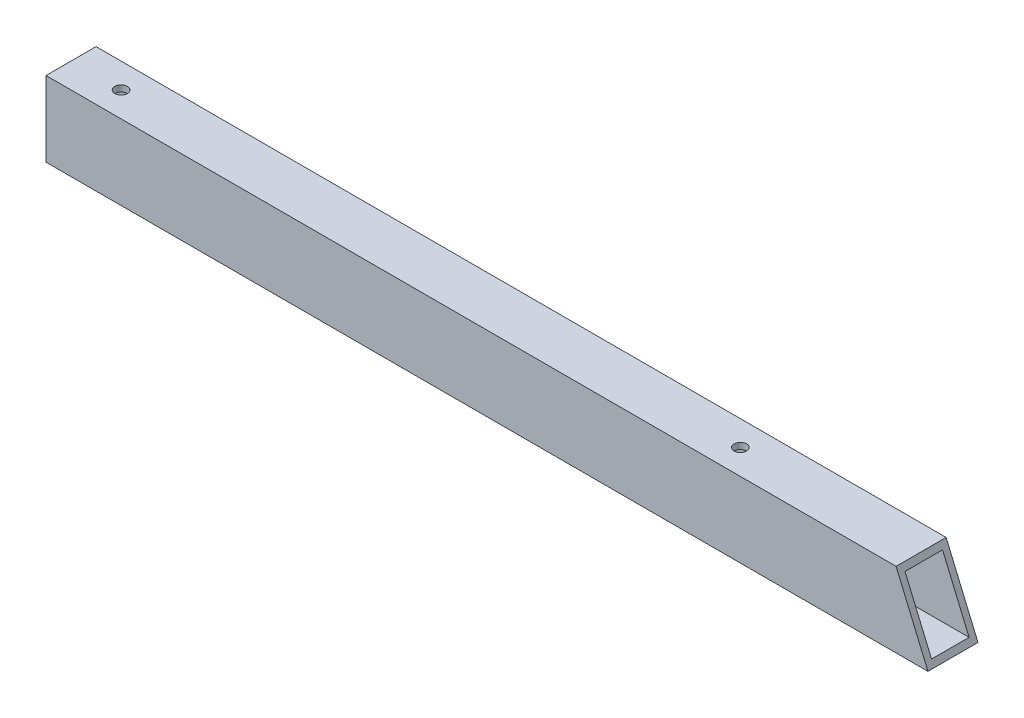
ISO-10303-21;
HEADER;
FILE_DESCRIPTION(('STEP AP214'),'2;1');
FILE_NAME('part.step','',(''),(''),'','','');
FILE_SCHEMA(('AUTOMOTIVE_DESIGN { 1 0 10303 214 1 1 1 1 }'));
ENDSEC;
DATA;
#1=APPLICATION_CONTEXT('core data for automotive mechanical design processes');
#2=APPLICATION_PROTOCOL_DEFINITION('international standard','automotive_design',2000,#1);
#3=PRODUCT_CONTEXT('',#1,'mechanical');
#4=PRODUCT('Part','Part','',(#3));
#5=PRODUCT_RELATED_PRODUCT_CATEGORY('part','',(#4));
#6=PRODUCT_DEFINITION_FORMATION('','',#4);
#7=PRODUCT_DEFINITION_CONTEXT('part definition',#1,'design');
#8=PRODUCT_DEFINITION('design','',#6,#7);
#9=PRODUCT_DEFINITION_SHAPE('','',#8);
#10=(LENGTH_UNIT() NAMED_UNIT(*) SI_UNIT(.MILLI.,.METRE.));
#11=(NAMED_UNIT(*) PLANE_ANGLE_UNIT() SI_UNIT($,.RADIAN.));
#12=(NAMED_UNIT(*) SI_UNIT($,.STERADIAN.) SOLID_ANGLE_UNIT());
#13=UNCERTAINTY_MEASURE_WITH_UNIT(LENGTH_MEASURE(1.E-05),#10,'distance_accuracy_value','');
#14=(GEOMETRIC_REPRESENTATION_CONTEXT(3) GLOBAL_UNCERTAINTY_ASSIGNED_CONTEXT((#13)) GLOBAL_UNIT_ASSIGNED_CONTEXT((#10,
#11,#12)) REPRESENTATION_CONTEXT('',''));
#15=CARTESIAN_POINT('',(0.,0.,0.));
#16=DIRECTION('',(0.,0.,1.));
#17=DIRECTION('',(1.,0.,0.));
#18=AXIS2_PLACEMENT_3D('',#15,#16,#17);
#19=CARTESIAN_POINT('',(-447.675,19.05,-12.7));
#20=DIRECTION('',(0.,0.,-1.));
#21=DIRECTION('',(0.,1.,0.));
#22=AXIS2_PLACEMENT_3D('',#19,#20,#21);
#23=PLANE('',#22);
#24=DIRECTION('',(0.390731128489268,-0.920504853452443,0.));
#25=VECTOR('',#24,1.);
#26=CARTESIAN_POINT('',(0.,-19.05,-12.7));
#27=LINE('',#26,#25);
#28=CARTESIAN_POINT('',(-16.1724904975857,19.05,-12.7));
#29=VERTEX_POINT('',#28);
#30=CARTESIAN_POINT('',(0.,-19.05,-12.7));
#31=VERTEX_POINT('',#30);
#32=EDGE_CURVE('E121',#29,#31,#27,.T.);
#33=ORIENTED_EDGE('',*,*,#32,.T.);
#34=DIRECTION('',(1.,0.,0.));
#35=VECTOR('',#34,1.);
#36=CARTESIAN_POINT('',(-447.675,-19.05,-12.7));
#37=LINE('',#36,#35);
#38=CARTESIAN_POINT('',(-447.675,-19.05,-12.7));
#39=VERTEX_POINT('',#38);
#40=EDGE_CURVE('E64',#39,#31,#37,.T.);
#41=ORIENTED_EDGE('',*,*,#40,.F.);
#42=DIRECTION('',(0.,1.,0.));
#43=VECTOR('',#42,1.);
#44=CARTESIAN_POINT('',(-447.675,19.05,-12.7));
#45=LINE('',#44,#43);
#46=CARTESIAN_POINT('',(-447.675,19.05,-12.7));
#47=VERTEX_POINT('',#46);
#48=EDGE_CURVE('E143',#39,#47,#45,.T.);
#49=ORIENTED_EDGE('',*,*,#48,.T.);
#50=DIRECTION('',(1.,0.,0.));
#51=VECTOR('',#50,1.);
#52=CARTESIAN_POINT('',(-447.675,19.05,-12.7));
#53=LINE('',#52,#51);
#54=EDGE_CURVE('E137',#47,#29,#53,.T.);
#55=ORIENTED_EDGE('',*,*,#54,.T.);
#56=EDGE_LOOP('',(#33,#41,#49,#55));
#57=FACE_BOUND('',#56,.T.);
#58=ADVANCED_FACE('F56',(#57),#23,.T.);
#59=CARTESIAN_POINT('',(-447.675,-19.05,12.7));
#60=DIRECTION('',(0.,-1.,0.));
#61=DIRECTION('',(0.,0.,-1.));
#62=AXIS2_PLACEMENT_3D('',#59,#60,#61);
#63=PLANE('',#62);
#64=CARTESIAN_POINT('',(-107.95,-19.05,0.));
#65=DIRECTION('',(0.,-1.,0.));
#66=DIRECTION('',(0.,0.,-1.));
#67=AXIS2_PLACEMENT_3D('',#64,#65,#66);
#68=CIRCLE('',#67,6.35);
#69=CARTESIAN_POINT('',(-107.95,-19.05,-6.35));
#70=VERTEX_POINT('',#69);
#71=EDGE_CURVE('E172',#70,#70,#68,.T.);
#72=ORIENTED_EDGE('',*,*,#71,.F.);
#73=EDGE_LOOP('',(#72));
#74=FACE_BOUND('',#73,.T.);
#75=CARTESIAN_POINT('',(-422.275,-19.05,0.));
#76=DIRECTION('',(0.,-1.,0.));
#77=DIRECTION('',(0.,0.,-1.));
#78=AXIS2_PLACEMENT_3D('',#75,#76,#77);
#79=CIRCLE('',#78,6.34999999999999);
#80=CARTESIAN_POINT('',(-422.275,-19.05,-6.34999999999999));
#81=VERTEX_POINT('',#80);
#82=EDGE_CURVE('E162',#81,#81,#79,.T.);
#83=ORIENTED_EDGE('',*,*,#82,.F.);
#84=EDGE_LOOP('',(#83));
#85=FACE_BOUND('',#84,.T.);
#86=DIRECTION('',(0.,0.,-1.));
#87=VECTOR('',#86,1.);
#88=CARTESIAN_POINT('',(0.,-19.05,12.7));
#89=LINE('',#88,#87);
#90=CARTESIAN_POINT('',(0.,-19.05,12.7));
#91=VERTEX_POINT('',#90);
#92=EDGE_CURVE('E127',#91,#31,#89,.T.);
#93=ORIENTED_EDGE('',*,*,#92,.F.);
#94=DIRECTION('',(1.,0.,0.));
#95=VECTOR('',#94,1.);
#96=CARTESIAN_POINT('',(-447.675,-19.05,12.7));
#97=LINE('',#96,#95);
#98=CARTESIAN_POINT('',(-447.675,-19.05,12.7));
#99=VERTEX_POINT('',#98);
#100=EDGE_CURVE('E146',#99,#91,#97,.T.);
#101=ORIENTED_EDGE('',*,*,#100,.F.);
#102=DIRECTION('',(0.,0.,-1.));
#103=VECTOR('',#102,1.);
#104=CARTESIAN_POINT('',(-447.675,-19.05,12.7));
#105=LINE('',#104,#103);
#106=EDGE_CURVE('E144',#99,#39,#105,.T.);
#107=ORIENTED_EDGE('',*,*,#106,.T.);
#108=ORIENTED_EDGE('',*,*,#40,.T.);
#109=EDGE_LOOP('',(#93,#101,#107,#108));
#110=FACE_BOUND('',#109,.T.);
#111=ADVANCED_FACE('F218',(#74,#85,#110),#63,.T.);
#112=CARTESIAN_POINT('',(-447.675,19.05,12.7));
#113=DIRECTION('',(0.,0.,1.));
#114=DIRECTION('',(0.,-1.,0.));
#115=AXIS2_PLACEMENT_3D('',#112,#113,#114);
#116=PLANE('',#115);
#117=DIRECTION('',(0.390731128489268,-0.920504853452443,0.));
#118=VECTOR('',#117,1.);
#119=CARTESIAN_POINT('',(0.,-19.05,12.7));
#120=LINE('',#119,#118);
#121=CARTESIAN_POINT('',(-16.1724904975857,19.05,12.7));
#122=VERTEX_POINT('',#121);
#123=EDGE_CURVE('E131',#122,#91,#120,.T.);
#124=ORIENTED_EDGE('',*,*,#123,.F.);
#125=DIRECTION('',(1.,0.,0.));
#126=VECTOR('',#125,1.);
#127=CARTESIAN_POINT('',(-447.675,19.05,12.7));
#128=LINE('',#127,#126);
#129=CARTESIAN_POINT('',(-447.675,19.05,12.7));
#130=VERTEX_POINT('',#129);
#131=EDGE_CURVE('E139',#130,#122,#128,.T.);
#132=ORIENTED_EDGE('',*,*,#131,.F.);
#133=DIRECTION('',(0.,-1.,0.));
#134=VECTOR('',#133,1.);
#135=CARTESIAN_POINT('',(-447.675,19.05,12.7));
#136=LINE('',#135,#134);
#137=EDGE_CURVE('E149',#130,#99,#136,.T.);
#138=ORIENTED_EDGE('',*,*,#137,.T.);
#139=ORIENTED_EDGE('',*,*,#100,.T.);
#140=EDGE_LOOP('',(#124,#132,#138,#139));
#141=FACE_BOUND('',#140,.T.);
#142=ADVANCED_FACE('F214',(#141),#116,.T.);
#143=CARTESIAN_POINT('',(-447.675,19.05,12.7));
#144=DIRECTION('',(0.,1.,0.));
#145=DIRECTION('',(0.,0.,1.));
#146=AXIS2_PLACEMENT_3D('',#143,#144,#145);
#147=PLANE('',#146);
#148=CARTESIAN_POINT('',(-107.95,19.05,0.));
#149=DIRECTION('',(0.,1.,0.));
#150=DIRECTION('',(0.,0.,1.));
#151=AXIS2_PLACEMENT_3D('',#148,#149,#150);
#152=CIRCLE('',#151,3.175);
#153=CARTESIAN_POINT('',(-107.95,19.05,3.175));
#154=VERTEX_POINT('',#153);
#155=EDGE_CURVE('E159',#154,#154,#152,.T.);
#156=ORIENTED_EDGE('',*,*,#155,.F.);
#157=EDGE_LOOP('',(#156));
#158=FACE_BOUND('',#157,.T.);
#159=CARTESIAN_POINT('',(-422.275,19.05,0.));
#160=DIRECTION('',(0.,1.,0.));
#161=DIRECTION('',(0.,0.,1.));
#162=AXIS2_PLACEMENT_3D('',#159,#160,#161);
#163=CIRCLE('',#162,3.17499999999997);
#164=CARTESIAN_POINT('',(-422.275,19.05,3.17499999999997));
#165=VERTEX_POINT('',#164);
#166=EDGE_CURVE('E156',#165,#165,#163,.T.);
#167=ORIENTED_EDGE('',*,*,#166,.F.);
#168=EDGE_LOOP('',(#167));
#169=FACE_BOUND('',#168,.T.);
#170=DIRECTION('',(0.,0.,1.));
#171=VECTOR('',#170,1.);
#172=CARTESIAN_POINT('',(-16.1724904975857,19.05,-12.7));
#173=LINE('',#172,#171);
#174=EDGE_CURVE('E124',#29,#122,#173,.T.);
#175=ORIENTED_EDGE('',*,*,#174,.F.);
#176=ORIENTED_EDGE('',*,*,#54,.F.);
#177=DIRECTION('',(0.,0.,1.));
#178=VECTOR('',#177,1.);
#179=CARTESIAN_POINT('',(-447.675,19.05,12.7));
#180=LINE('',#179,#178);
#181=EDGE_CURVE('E207',#47,#130,#180,.T.);
#182=ORIENTED_EDGE('',*,*,#181,.T.);
#183=ORIENTED_EDGE('',*,*,#131,.T.);
#184=EDGE_LOOP('',(#175,#176,#182,#183));
#185=FACE_BOUND('',#184,.T.);
#186=ADVANCED_FACE('F135',(#158,#169,#185),#147,.T.);
#187=CARTESIAN_POINT('',(-447.675,0.,0.));
#188=DIRECTION('',(1.,0.,0.));
#189=DIRECTION('',(0.,0.,-1.));
#190=AXIS2_PLACEMENT_3D('',#187,#188,#189);
#191=PLANE('',#190);
#192=DIRECTION('',(0.,0.,-1.));
#193=VECTOR('',#192,1.);
#194=CARTESIAN_POINT('',(-447.675,-15.875,12.7));
#195=LINE('',#194,#193);
#196=CARTESIAN_POINT('',(-447.675,-15.875,9.525));
#197=VERTEX_POINT('',#196);
#198=CARTESIAN_POINT('',(-447.675,-15.875,-9.525));
#199=VERTEX_POINT('',#198);
#200=EDGE_CURVE('E192',#197,#199,#195,.T.);
#201=ORIENTED_EDGE('',*,*,#200,.T.);
#202=DIRECTION('',(0.,1.,0.));
#203=VECTOR('',#202,1.);
#204=CARTESIAN_POINT('',(-447.675,19.05,-9.525));
#205=LINE('',#204,#203);
#206=CARTESIAN_POINT('',(-447.675,15.875,-9.525));
#207=VERTEX_POINT('',#206);
#208=EDGE_CURVE('E185',#199,#207,#205,.T.);
#209=ORIENTED_EDGE('',*,*,#208,.T.);
#210=DIRECTION('',(0.,0.,1.));
#211=VECTOR('',#210,1.);
#212=CARTESIAN_POINT('',(-447.675,15.875,12.7));
#213=LINE('',#212,#211);
#214=CARTESIAN_POINT('',(-447.675,15.875,9.52500000000001));
#215=VERTEX_POINT('',#214);
#216=EDGE_CURVE('E188',#207,#215,#213,.T.);
#217=ORIENTED_EDGE('',*,*,#216,.T.);
#218=DIRECTION('',(0.,-1.,0.));
#219=VECTOR('',#218,1.);
#220=CARTESIAN_POINT('',(-447.675,19.05,9.52500000000001));
#221=LINE('',#220,#219);
#222=EDGE_CURVE('E79',#215,#197,#221,.T.);
#223=ORIENTED_EDGE('',*,*,#222,.T.);
#224=EDGE_LOOP('',(#201,#209,#217,#223));
#225=FACE_BOUND('',#224,.T.);
#226=ORIENTED_EDGE('',*,*,#48,.F.);
#227=ORIENTED_EDGE('',*,*,#106,.F.);
#228=ORIENTED_EDGE('',*,*,#137,.F.);
#229=ORIENTED_EDGE('',*,*,#181,.F.);
#230=EDGE_LOOP('',(#226,#227,#228,#229));
#231=FACE_BOUND('',#230,.T.);
#232=ADVANCED_FACE('F220',(#225,#231),#191,.F.);
#233=CARTESIAN_POINT('',(-447.675,19.05,-9.525));
#234=DIRECTION('',(0.,0.,-1.));
#235=DIRECTION('',(0.,1.,0.));
#236=AXIS2_PLACEMENT_3D('',#233,#234,#235);
#237=PLANE('',#236);
#238=DIRECTION('',(1.,0.,0.));
#239=VECTOR('',#238,1.);
#240=CARTESIAN_POINT('',(-447.675,-15.875,-9.525));
#241=LINE('',#240,#239);
#242=CARTESIAN_POINT('',(-1.34770754146546,-15.875,-9.525));
#243=VERTEX_POINT('',#242);
#244=EDGE_CURVE('E196',#199,#243,#241,.T.);
#245=ORIENTED_EDGE('',*,*,#244,.T.);
#246=DIRECTION('',(-0.390731128489268,0.920504853452443,0.));
#247=VECTOR('',#246,1.);
#248=CARTESIAN_POINT('',(-82.0503301988335,174.248464515545,-9.52499999999997));
#249=LINE('',#248,#247);
#250=CARTESIAN_POINT('',(-14.8247829561202,15.875,-9.52499999999999));
#251=VERTEX_POINT('',#250);
#252=EDGE_CURVE('E182',#243,#251,#249,.T.);
#253=ORIENTED_EDGE('',*,*,#252,.T.);
#254=DIRECTION('',(1.,0.,0.));
#255=VECTOR('',#254,1.);
#256=CARTESIAN_POINT('',(-447.675,15.875,-9.525));
#257=LINE('',#256,#255);
#258=EDGE_CURVE('E195',#207,#251,#257,.T.);
#259=ORIENTED_EDGE('',*,*,#258,.F.);
#260=ORIENTED_EDGE('',*,*,#208,.F.);
#261=EDGE_LOOP('',(#245,#253,#259,#260));
#262=FACE_BOUND('',#261,.T.);
#263=ADVANCED_FACE('F222',(#262),#237,.F.);
#264=CARTESIAN_POINT('',(-447.675,-15.875,12.7));
#265=DIRECTION('',(0.,-1.,0.));
#266=DIRECTION('',(0.,0.,-1.));
#267=AXIS2_PLACEMENT_3D('',#264,#265,#266);
#268=PLANE('',#267);
#269=CARTESIAN_POINT('',(-107.95,-15.875,0.));
#270=DIRECTION('',(0.,-1.,0.));
#271=DIRECTION('',(0.,0.,-1.));
#272=AXIS2_PLACEMENT_3D('',#269,#270,#271);
#273=CIRCLE('',#272,6.35);
#274=CARTESIAN_POINT('',(-107.95,-15.875,-6.35));
#275=VERTEX_POINT('',#274);
#276=EDGE_CURVE('E59',#275,#275,#273,.T.);
#277=ORIENTED_EDGE('',*,*,#276,.T.);
#278=EDGE_LOOP('',(#277));
#279=FACE_BOUND('',#278,.T.);
#280=CARTESIAN_POINT('',(-422.275,-15.875,0.));
#281=DIRECTION('',(0.,-1.,0.));
#282=DIRECTION('',(0.,0.,-1.));
#283=AXIS2_PLACEMENT_3D('',#280,#281,#282);
#284=CIRCLE('',#283,6.34999999999999);
#285=CARTESIAN_POINT('',(-422.275,-15.875,-6.34999999999999));
#286=VERTEX_POINT('',#285);
#287=EDGE_CURVE('E160',#286,#286,#284,.T.);
#288=ORIENTED_EDGE('',*,*,#287,.T.);
#289=EDGE_LOOP('',(#288));
#290=FACE_BOUND('',#289,.T.);
#291=DIRECTION('',(1.,0.,0.));
#292=VECTOR('',#291,1.);
#293=CARTESIAN_POINT('',(-447.675,-15.875,9.525));
#294=LINE('',#293,#292);
#295=CARTESIAN_POINT('',(-1.34770754146553,-15.875,9.525));
#296=VERTEX_POINT('',#295);
#297=EDGE_CURVE('E199',#197,#296,#294,.T.);
#298=ORIENTED_EDGE('',*,*,#297,.T.);
#299=DIRECTION('',(0.,0.,-1.));
#300=VECTOR('',#299,1.);
#301=CARTESIAN_POINT('',(-1.34770754146546,-15.875,12.7));
#302=LINE('',#301,#300);
#303=EDGE_CURVE('E179',#296,#243,#302,.T.);
#304=ORIENTED_EDGE('',*,*,#303,.T.);
#305=ORIENTED_EDGE('',*,*,#244,.F.);
#306=ORIENTED_EDGE('',*,*,#200,.F.);
#307=EDGE_LOOP('',(#298,#304,#305,#306));
#308=FACE_BOUND('',#307,.T.);
#309=ADVANCED_FACE('F229',(#279,#290,#308),#268,.F.);
#310=CARTESIAN_POINT('',(-447.675,19.05,9.52500000000001));
#311=DIRECTION('',(0.,0.,1.));
#312=DIRECTION('',(0.,-1.,0.));
#313=AXIS2_PLACEMENT_3D('',#310,#311,#312);
#314=PLANE('',#313);
#315=DIRECTION('',(1.,0.,0.));
#316=VECTOR('',#315,1.);
#317=CARTESIAN_POINT('',(-447.675,15.875,9.52500000000001));
#318=LINE('',#317,#316);
#319=CARTESIAN_POINT('',(-14.8247829561202,15.875,9.52500000000001));
#320=VERTEX_POINT('',#319);
#321=EDGE_CURVE('E202',#215,#320,#318,.T.);
#322=ORIENTED_EDGE('',*,*,#321,.T.);
#323=DIRECTION('',(0.390731128489268,-0.920504853452443,0.));
#324=VECTOR('',#323,1.);
#325=CARTESIAN_POINT('',(-82.0503301988335,174.248464515545,9.52500000000003));
#326=LINE('',#325,#324);
#327=EDGE_CURVE('E72',#320,#296,#326,.T.);
#328=ORIENTED_EDGE('',*,*,#327,.T.);
#329=ORIENTED_EDGE('',*,*,#297,.F.);
#330=ORIENTED_EDGE('',*,*,#222,.F.);
#331=EDGE_LOOP('',(#322,#328,#329,#330));
#332=FACE_BOUND('',#331,.T.);
#333=ADVANCED_FACE('F255',(#332),#314,.F.);
#334=CARTESIAN_POINT('',(-447.675,15.875,12.7));
#335=DIRECTION('',(0.,1.,0.));
#336=DIRECTION('',(0.,0.,1.));
#337=AXIS2_PLACEMENT_3D('',#334,#335,#336);
#338=PLANE('',#337);
#339=CARTESIAN_POINT('',(-107.95,15.875,0.));
#340=DIRECTION('',(0.,1.,0.));
#341=DIRECTION('',(0.,0.,1.));
#342=AXIS2_PLACEMENT_3D('',#339,#340,#341);
#343=CIRCLE('',#342,3.175);
#344=CARTESIAN_POINT('',(-107.95,15.875,3.175));
#345=VERTEX_POINT('',#344);
#346=EDGE_CURVE('E157',#345,#345,#343,.T.);
#347=ORIENTED_EDGE('',*,*,#346,.T.);
#348=EDGE_LOOP('',(#347));
#349=FACE_BOUND('',#348,.T.);
#350=CARTESIAN_POINT('',(-422.275,15.875,0.));
#351=DIRECTION('',(0.,1.,0.));
#352=DIRECTION('',(0.,0.,1.));
#353=AXIS2_PLACEMENT_3D('',#350,#351,#352);
#354=CIRCLE('',#353,3.17499999999997);
#355=CARTESIAN_POINT('',(-422.275,15.875,3.17499999999997));
#356=VERTEX_POINT('',#355);
#357=EDGE_CURVE('E153',#356,#356,#354,.T.);
#358=ORIENTED_EDGE('',*,*,#357,.T.);
#359=EDGE_LOOP('',(#358));
#360=FACE_BOUND('',#359,.T.);
#361=ORIENTED_EDGE('',*,*,#258,.T.);
#362=DIRECTION('',(0.,0.,1.));
#363=VECTOR('',#362,1.);
#364=CARTESIAN_POINT('',(-14.8247829561202,15.875,12.7));
#365=LINE('',#364,#363);
#366=EDGE_CURVE('E12',#251,#320,#365,.T.);
#367=ORIENTED_EDGE('',*,*,#366,.T.);
#368=ORIENTED_EDGE('',*,*,#321,.F.);
#369=ORIENTED_EDGE('',*,*,#216,.F.);
#370=EDGE_LOOP('',(#361,#367,#368,#369));
#371=FACE_BOUND('',#370,.T.);
#372=ADVANCED_FACE('F261',(#349,#360,#371),#338,.F.);
#373=CARTESIAN_POINT('',(0.,-19.05,-12.7));
#374=DIRECTION('',(-0.920504853452443,-0.390731128489268,0.));
#375=DIRECTION('',(0.390731128489268,-0.920504853452443,0.));
#376=AXIS2_PLACEMENT_3D('',#373,#374,#375);
#377=PLANE('',#376);
#378=ORIENTED_EDGE('',*,*,#123,.T.);
#379=ORIENTED_EDGE('',*,*,#92,.T.);
#380=ORIENTED_EDGE('',*,*,#32,.F.);
#381=ORIENTED_EDGE('',*,*,#174,.T.);
#382=EDGE_LOOP('',(#378,#379,#380,#381));
#383=FACE_BOUND('',#382,.T.);
#384=ORIENTED_EDGE('',*,*,#303,.F.);
#385=ORIENTED_EDGE('',*,*,#327,.F.);
#386=ORIENTED_EDGE('',*,*,#366,.F.);
#387=ORIENTED_EDGE('',*,*,#252,.F.);
#388=EDGE_LOOP('',(#384,#385,#386,#387));
#389=FACE_BOUND('',#388,.T.);
#390=ADVANCED_FACE('F123',(#383,#389),#377,.F.);
#391=CARTESIAN_POINT('',(-422.275,-19.05,0.));
#392=DIRECTION('',(0.,1.,0.));
#393=DIRECTION('',(0.,0.,1.));
#394=AXIS2_PLACEMENT_3D('',#391,#392,#393);
#395=CYLINDRICAL_SURFACE('',#394,3.17499999999997);
#396=CARTESIAN_POINT('',(-422.275,19.05,3.17499999999997));
#397=CARTESIAN_POINT('',(-422.275,19.0169270833333,3.17499999999997));
#398=CARTESIAN_POINT('',(-422.275,18.9838541666667,3.17499999999997));
#399=CARTESIAN_POINT('',(-422.275,18.9177083333333,3.17499999999997));
#400=CARTESIAN_POINT('',(-422.275,18.8846354166667,3.17499999999997));
#401=CARTESIAN_POINT('',(-422.275,18.8184895833333,3.17499999999997));
#402=CARTESIAN_POINT('',(-422.275,18.7854166666667,3.17499999999997));
#403=CARTESIAN_POINT('',(-422.275,18.7192708333333,3.17499999999997));
#404=CARTESIAN_POINT('',(-422.275,18.6861979166667,3.17499999999997));
#405=CARTESIAN_POINT('',(-422.275,18.6200520833333,3.17499999999997));
#406=CARTESIAN_POINT('',(-422.275,18.5869791666667,3.17499999999997));
#407=CARTESIAN_POINT('',(-422.275,18.5208333333333,3.17499999999997));
#408=CARTESIAN_POINT('',(-422.275,18.4877604166667,3.17499999999997));
#409=CARTESIAN_POINT('',(-422.275,18.4216145833333,3.17499999999997));
#410=CARTESIAN_POINT('',(-422.275,18.3885416666667,3.17499999999997));
#411=CARTESIAN_POINT('',(-422.275,18.3223958333333,3.17499999999997));
#412=CARTESIAN_POINT('',(-422.275,18.2893229166667,3.17499999999997));
#413=CARTESIAN_POINT('',(-422.275,18.2231770833333,3.17499999999997));
#414=CARTESIAN_POINT('',(-422.275,18.1901041666667,3.17499999999997));
#415=CARTESIAN_POINT('',(-422.275,18.1239583333333,3.17499999999997));
#416=CARTESIAN_POINT('',(-422.275,18.0908854166667,3.17499999999997));
#417=CARTESIAN_POINT('',(-422.275,18.0247395833333,3.17499999999997));
#418=CARTESIAN_POINT('',(-422.275,17.9916666666667,3.17499999999997));
#419=CARTESIAN_POINT('',(-422.275,17.9255208333333,3.17499999999997));
#420=CARTESIAN_POINT('',(-422.275,17.8924479166667,3.17499999999997));
#421=CARTESIAN_POINT('',(-422.275,17.8263020833333,3.17499999999997));
#422=CARTESIAN_POINT('',(-422.275,17.7932291666667,3.17499999999997));
#423=CARTESIAN_POINT('',(-422.275,17.7270833333333,3.17499999999997));
#424=CARTESIAN_POINT('',(-422.275,17.6940104166667,3.17499999999997));
#425=CARTESIAN_POINT('',(-422.275,17.6278645833333,3.17499999999997));
#426=CARTESIAN_POINT('',(-422.275,17.5947916666667,3.17499999999997));
#427=CARTESIAN_POINT('',(-422.275,17.5286458333333,3.17499999999997));
#428=CARTESIAN_POINT('',(-422.275,17.4955729166667,3.17499999999997));
#429=CARTESIAN_POINT('',(-422.275,17.4294270833333,3.17499999999997));
#430=CARTESIAN_POINT('',(-422.275,17.3963541666667,3.17499999999997));
#431=CARTESIAN_POINT('',(-422.275,17.3302083333333,3.17499999999997));
#432=CARTESIAN_POINT('',(-422.275,17.2971354166667,3.17499999999997));
#433=CARTESIAN_POINT('',(-422.275,17.2309895833333,3.17499999999997));
#434=CARTESIAN_POINT('',(-422.275,17.1979166666667,3.17499999999997));
#435=CARTESIAN_POINT('',(-422.275,17.1317708333333,3.17499999999997));
#436=CARTESIAN_POINT('',(-422.275,17.0986979166667,3.17499999999997));
#437=CARTESIAN_POINT('',(-422.275,17.0325520833333,3.17499999999997));
#438=CARTESIAN_POINT('',(-422.275,16.9994791666667,3.17499999999997));
#439=CARTESIAN_POINT('',(-422.275,16.9333333333333,3.17499999999997));
#440=CARTESIAN_POINT('',(-422.275,16.9002604166667,3.17499999999997));
#441=CARTESIAN_POINT('',(-422.275,16.8341145833333,3.17499999999997));
#442=CARTESIAN_POINT('',(-422.275,16.8010416666667,3.17499999999997));
#443=CARTESIAN_POINT('',(-422.275,16.7348958333333,3.17499999999997));
#444=CARTESIAN_POINT('',(-422.275,16.7018229166667,3.17499999999997));
#445=CARTESIAN_POINT('',(-422.275,16.6356770833333,3.17499999999997));
#446=CARTESIAN_POINT('',(-422.275,16.6026041666667,3.17499999999997));
#447=CARTESIAN_POINT('',(-422.275,16.5364583333333,3.17499999999997));
#448=CARTESIAN_POINT('',(-422.275,16.5033854166667,3.17499999999997));
#449=CARTESIAN_POINT('',(-422.275,16.4372395833333,3.17499999999997));
#450=CARTESIAN_POINT('',(-422.275,16.4041666666667,3.17499999999997));
#451=CARTESIAN_POINT('',(-422.275,16.3380208333333,3.17499999999997));
#452=CARTESIAN_POINT('',(-422.275,16.3049479166667,3.17499999999997));
#453=CARTESIAN_POINT('',(-422.275,16.2388020833333,3.17499999999997));
#454=CARTESIAN_POINT('',(-422.275,16.2057291666667,3.17499999999997));
#455=CARTESIAN_POINT('',(-422.275,16.1395833333333,3.17499999999997));
#456=CARTESIAN_POINT('',(-422.275,16.1065104166667,3.17499999999997));
#457=CARTESIAN_POINT('',(-422.275,16.0403645833333,3.17499999999997));
#458=CARTESIAN_POINT('',(-422.275,16.0072916666667,3.17499999999997));
#459=CARTESIAN_POINT('',(-422.275,15.9411458333333,3.17499999999997));
#460=CARTESIAN_POINT('',(-422.275,15.9080729166667,3.17499999999997));
#461=CARTESIAN_POINT('',(-422.275,15.875,3.17499999999997));
#462=B_SPLINE_CURVE_WITH_KNOTS('',3,(#396,#397,#398,#399,#400,#401,#402,#403,#404,#405,#406,
#407,#408,#409,#410,#411,#412,#413,#414,#415,#416,#417,#418,#419,#420,#421,#422,#423,#424,#425,
#426,#427,#428,#429,#430,#431,#432,#433,#434,#435,#436,#437,#438,#439,#440,#441,#442,#443,#444,
#445,#446,#447,#448,#449,#450,#451,#452,#453,#454,#455,#456,#457,#458,#459,#460,#461),
.UNSPECIFIED.,.F.,.F.,(4,2,2,2,2,2,2,2,2,2,2,2,2,2,2,2,2,2,2,2,2,2,2,2,2,2,2,2,2,2,2,2,4),(0.,
0.0992187499999977,0.198437500000002,0.29765625,0.396875000000005,0.496093750000003,0.5953125,
0.694531250000005,0.793750000000003,0.892968750000001,0.992187500000005,1.09140625,1.190625,
1.28984375000001,1.3890625,1.48828125000001,1.58750000000001,1.68671875,1.78593750000001,
1.88515625000001,1.98437500000001,2.08359375000001,2.18281250000001,2.28203125000001,
2.38125000000001,2.48046875000001,2.57968750000001,2.67890625000001,2.77812500000001,
2.87734375000001,2.97656250000001,3.07578125000001,3.17500000000001),.UNSPECIFIED.);
#463=EDGE_CURVE('BSEAM264',#165,#356,#462,.T.);
#464=ORIENTED_EDGE('',*,*,#166,.T.);
#465=ORIENTED_EDGE('',*,*,#357,.F.);
#466=ORIENTED_EDGE('',*,*,#463,.T.);
#467=ORIENTED_EDGE('',*,*,#463,.F.);
#468=EDGE_LOOP('',(#464,#466,#465,#467));
#469=FACE_BOUND('',#468,.T.);
#470=ADVANCED_FACE('F264',(#469),#395,.F.);
#471=CARTESIAN_POINT('',(-107.95,-19.05,0.));
#472=DIRECTION('',(0.,1.,0.));
#473=DIRECTION('',(0.,0.,1.));
#474=AXIS2_PLACEMENT_3D('',#471,#472,#473);
#475=CYLINDRICAL_SURFACE('',#474,3.175);
#476=CARTESIAN_POINT('',(-107.95,19.05,3.175));
#477=CARTESIAN_POINT('',(-107.95,19.0169270833333,3.175));
#478=CARTESIAN_POINT('',(-107.95,18.9838541666667,3.175));
#479=CARTESIAN_POINT('',(-107.95,18.9177083333333,3.175));
#480=CARTESIAN_POINT('',(-107.95,18.8846354166667,3.175));
#481=CARTESIAN_POINT('',(-107.95,18.8184895833333,3.175));
#482=CARTESIAN_POINT('',(-107.95,18.7854166666667,3.175));
#483=CARTESIAN_POINT('',(-107.95,18.7192708333333,3.175));
#484=CARTESIAN_POINT('',(-107.95,18.6861979166667,3.175));
#485=CARTESIAN_POINT('',(-107.95,18.6200520833333,3.175));
#486=CARTESIAN_POINT('',(-107.95,18.5869791666667,3.175));
#487=CARTESIAN_POINT('',(-107.95,18.5208333333333,3.175));
#488=CARTESIAN_POINT('',(-107.95,18.4877604166667,3.175));
#489=CARTESIAN_POINT('',(-107.95,18.4216145833333,3.175));
#490=CARTESIAN_POINT('',(-107.95,18.3885416666667,3.175));
#491=CARTESIAN_POINT('',(-107.95,18.3223958333333,3.175));
#492=CARTESIAN_POINT('',(-107.95,18.2893229166667,3.175));
#493=CARTESIAN_POINT('',(-107.95,18.2231770833333,3.175));
#494=CARTESIAN_POINT('',(-107.95,18.1901041666667,3.175));
#495=CARTESIAN_POINT('',(-107.95,18.1239583333333,3.175));
#496=CARTESIAN_POINT('',(-107.95,18.0908854166667,3.175));
#497=CARTESIAN_POINT('',(-107.95,18.0247395833333,3.175));
#498=CARTESIAN_POINT('',(-107.95,17.9916666666667,3.175));
#499=CARTESIAN_POINT('',(-107.95,17.9255208333333,3.175));
#500=CARTESIAN_POINT('',(-107.95,17.8924479166667,3.175));
#501=CARTESIAN_POINT('',(-107.95,17.8263020833333,3.175));
#502=CARTESIAN_POINT('',(-107.95,17.7932291666667,3.175));
#503=CARTESIAN_POINT('',(-107.95,17.7270833333333,3.175));
#504=CARTESIAN_POINT('',(-107.95,17.6940104166667,3.175));
#505=CARTESIAN_POINT('',(-107.95,17.6278645833333,3.175));
#506=CARTESIAN_POINT('',(-107.95,17.5947916666667,3.175));
#507=CARTESIAN_POINT('',(-107.95,17.5286458333333,3.175));
#508=CARTESIAN_POINT('',(-107.95,17.4955729166667,3.175));
#509=CARTESIAN_POINT('',(-107.95,17.4294270833333,3.175));
#510=CARTESIAN_POINT('',(-107.95,17.3963541666667,3.175));
#511=CARTESIAN_POINT('',(-107.95,17.3302083333333,3.175));
#512=CARTESIAN_POINT('',(-107.95,17.2971354166667,3.175));
#513=CARTESIAN_POINT('',(-107.95,17.2309895833333,3.175));
#514=CARTESIAN_POINT('',(-107.95,17.1979166666667,3.175));
#515=CARTESIAN_POINT('',(-107.95,17.1317708333333,3.175));
#516=CARTESIAN_POINT('',(-107.95,17.0986979166667,3.175));
#517=CARTESIAN_POINT('',(-107.95,17.0325520833333,3.175));
#518=CARTESIAN_POINT('',(-107.95,16.9994791666667,3.175));
#519=CARTESIAN_POINT('',(-107.95,16.9333333333333,3.175));
#520=CARTESIAN_POINT('',(-107.95,16.9002604166667,3.175));
#521=CARTESIAN_POINT('',(-107.95,16.8341145833333,3.175));
#522=CARTESIAN_POINT('',(-107.95,16.8010416666667,3.175));
#523=CARTESIAN_POINT('',(-107.95,16.7348958333333,3.175));
#524=CARTESIAN_POINT('',(-107.95,16.7018229166667,3.175));
#525=CARTESIAN_POINT('',(-107.95,16.6356770833333,3.175));
#526=CARTESIAN_POINT('',(-107.95,16.6026041666667,3.175));
#527=CARTESIAN_POINT('',(-107.95,16.5364583333333,3.175));
#528=CARTESIAN_POINT('',(-107.95,16.5033854166667,3.175));
#529=CARTESIAN_POINT('',(-107.95,16.4372395833333,3.175));
#530=CARTESIAN_POINT('',(-107.95,16.4041666666667,3.175));
#531=CARTESIAN_POINT('',(-107.95,16.3380208333333,3.175));
#532=CARTESIAN_POINT('',(-107.95,16.3049479166667,3.175));
#533=CARTESIAN_POINT('',(-107.95,16.2388020833333,3.175));
#534=CARTESIAN_POINT('',(-107.95,16.2057291666667,3.175));
#535=CARTESIAN_POINT('',(-107.95,16.1395833333333,3.175));
#536=CARTESIAN_POINT('',(-107.95,16.1065104166667,3.175));
#537=CARTESIAN_POINT('',(-107.95,16.0403645833333,3.175));
#538=CARTESIAN_POINT('',(-107.95,16.0072916666667,3.175));
#539=CARTESIAN_POINT('',(-107.95,15.9411458333333,3.175));
#540=CARTESIAN_POINT('',(-107.95,15.9080729166667,3.175));
#541=CARTESIAN_POINT('',(-107.95,15.875,3.175));
#542=B_SPLINE_CURVE_WITH_KNOTS('',3,(#476,#477,#478,#479,#480,#481,#482,#483,#484,#485,#486,
#487,#488,#489,#490,#491,#492,#493,#494,#495,#496,#497,#498,#499,#500,#501,#502,#503,#504,#505,
#506,#507,#508,#509,#510,#511,#512,#513,#514,#515,#516,#517,#518,#519,#520,#521,#522,#523,#524,
#525,#526,#527,#528,#529,#530,#531,#532,#533,#534,#535,#536,#537,#538,#539,#540,#541),
.UNSPECIFIED.,.F.,.F.,(4,2,2,2,2,2,2,2,2,2,2,2,2,2,2,2,2,2,2,2,2,2,2,2,2,2,2,2,2,2,2,2,4),(0.,
0.0992187499999977,0.198437500000002,0.29765625,0.396875000000005,0.496093750000003,0.5953125,
0.694531250000005,0.793750000000003,0.892968750000001,0.992187500000005,1.09140625,1.190625,
1.28984375000001,1.3890625,1.48828125000001,1.58750000000001,1.68671875,1.78593750000001,
1.88515625000001,1.98437500000001,2.08359375000001,2.18281250000001,2.28203125000001,
2.38125000000001,2.48046875000001,2.57968750000001,2.67890625000001,2.77812500000001,
2.87734375000001,2.97656250000001,3.07578125000001,3.17500000000001),.UNSPECIFIED.);
#543=EDGE_CURVE('BSEAM270',#154,#345,#542,.T.);
#544=ORIENTED_EDGE('',*,*,#155,.T.);
#545=ORIENTED_EDGE('',*,*,#346,.F.);
#546=ORIENTED_EDGE('',*,*,#543,.T.);
#547=ORIENTED_EDGE('',*,*,#543,.F.);
#548=EDGE_LOOP('',(#544,#546,#545,#547));
#549=FACE_BOUND('',#548,.T.);
#550=ADVANCED_FACE('F270',(#549),#475,.F.);
#551=CARTESIAN_POINT('',(-422.275,-6.35,0.));
#552=DIRECTION('',(0.,-1.,0.));
#553=DIRECTION('',(0.,0.,-1.));
#554=AXIS2_PLACEMENT_3D('',#551,#552,#553);
#555=CYLINDRICAL_SURFACE('',#554,6.34999999999999);
#556=ORIENTED_EDGE('',*,*,#82,.T.);
#557=EDGE_LOOP('',(#556));
#558=FACE_BOUND('',#557,.T.);
#559=ORIENTED_EDGE('',*,*,#287,.F.);
#560=EDGE_LOOP('',(#559));
#561=FACE_BOUND('',#560,.T.);
#562=ADVANCED_FACE('F250',(#558,#561),#555,.F.);
#563=CARTESIAN_POINT('',(-107.95,-6.35,0.));
#564=DIRECTION('',(0.,-1.,0.));
#565=DIRECTION('',(0.,0.,-1.));
#566=AXIS2_PLACEMENT_3D('',#563,#564,#565);
#567=CYLINDRICAL_SURFACE('',#566,6.35);
#568=ORIENTED_EDGE('',*,*,#71,.T.);
#569=EDGE_LOOP('',(#568));
#570=FACE_BOUND('',#569,.T.);
#571=ORIENTED_EDGE('',*,*,#276,.F.);
#572=EDGE_LOOP('',(#571));
#573=FACE_BOUND('',#572,.T.);
#574=ADVANCED_FACE('F247',(#570,#573),#567,.F.);
#575=CLOSED_SHELL('',(#58,#111,#142,#186,#232,#263,#309,#333,#372,#390,#470,#550,#562,#574));
#576=MANIFOLD_SOLID_BREP('B2',#575);
#577=ADVANCED_BREP_SHAPE_REPRESENTATION('',(#18,#576),#14);
#578=SHAPE_DEFINITION_REPRESENTATION(#9,#577);
ENDSEC;
END-ISO-10303-21;
